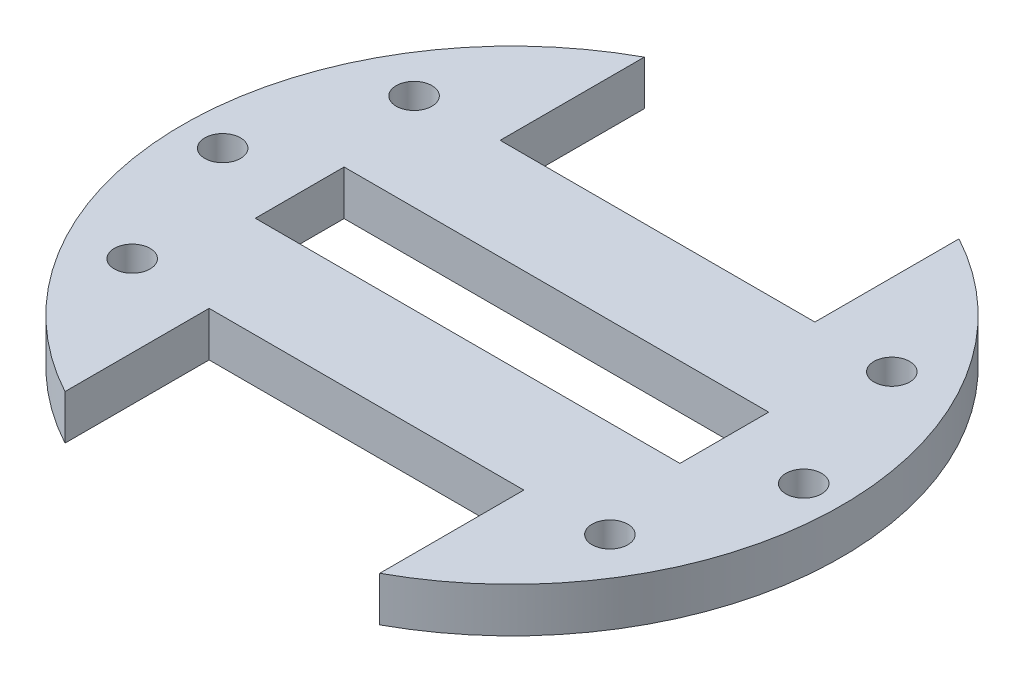
ISO-10303-21;
HEADER;
FILE_DESCRIPTION(('STEP AP214'),'2;1');
FILE_NAME('part.step','',(''),(''),'','','');
FILE_SCHEMA(('AUTOMOTIVE_DESIGN { 1 0 10303 214 1 1 1 1 }'));
ENDSEC;
DATA;
#1=APPLICATION_CONTEXT('core data for automotive mechanical design processes');
#2=APPLICATION_PROTOCOL_DEFINITION('international standard','automotive_design',2000,#1);
#3=PRODUCT_CONTEXT('',#1,'mechanical');
#4=PRODUCT('Part','Part','',(#3));
#5=PRODUCT_RELATED_PRODUCT_CATEGORY('part','',(#4));
#6=PRODUCT_DEFINITION_FORMATION('','',#4);
#7=PRODUCT_DEFINITION_CONTEXT('part definition',#1,'design');
#8=PRODUCT_DEFINITION('design','',#6,#7);
#9=PRODUCT_DEFINITION_SHAPE('','',#8);
#10=(LENGTH_UNIT() NAMED_UNIT(*) SI_UNIT(.MILLI.,.METRE.));
#11=(NAMED_UNIT(*) PLANE_ANGLE_UNIT() SI_UNIT($,.RADIAN.));
#12=(NAMED_UNIT(*) SI_UNIT($,.STERADIAN.) SOLID_ANGLE_UNIT());
#13=UNCERTAINTY_MEASURE_WITH_UNIT(LENGTH_MEASURE(1.E-05),#10,'distance_accuracy_value','');
#14=(GEOMETRIC_REPRESENTATION_CONTEXT(3) GLOBAL_UNCERTAINTY_ASSIGNED_CONTEXT((#13)) GLOBAL_UNIT_ASSIGNED_CONTEXT((#10,
#11,#12)) REPRESENTATION_CONTEXT('',''));
#15=CARTESIAN_POINT('',(0.,0.,0.));
#16=DIRECTION('',(0.,0.,1.));
#17=DIRECTION('',(1.,0.,0.));
#18=AXIS2_PLACEMENT_3D('',#15,#16,#17);
#19=CARTESIAN_POINT('',(0.,4.,0.));
#20=DIRECTION('',(0.,-1.,0.));
#21=DIRECTION('',(0.,0.,-1.));
#22=AXIS2_PLACEMENT_3D('',#19,#20,#21);
#23=CYLINDRICAL_SURFACE('',#22,29.5);
#24=CARTESIAN_POINT('',(0.,0.,0.));
#25=DIRECTION('',(0.,1.,0.));
#26=DIRECTION('',(0.,0.,1.));
#27=AXIS2_PLACEMENT_3D('',#24,#25,#26);
#28=CIRCLE('',#27,29.5);
#29=CARTESIAN_POINT('',(14.0831265655498,0.,25.9213338032345));
#30=VERTEX_POINT('',#29);
#31=CARTESIAN_POINT('',(14.0831265655494,0.,-25.9213338032347));
#32=VERTEX_POINT('',#31);
#33=EDGE_CURVE('E221',#30,#32,#28,.T.);
#34=ORIENTED_EDGE('',*,*,#33,.T.);
#35=DIRECTION('',(0.,-1.,0.));
#36=VECTOR('',#35,1.);
#37=CARTESIAN_POINT('',(14.0831265655494,4.,-25.9213338032347));
#38=LINE('',#37,#36);
#39=CARTESIAN_POINT('',(14.0831265655494,4.,-25.9213338032347));
#40=VERTEX_POINT('',#39);
#41=EDGE_CURVE('E213',#32,#40,#38,.F.);
#42=ORIENTED_EDGE('',*,*,#41,.T.);
#43=CARTESIAN_POINT('',(0.,4.,0.));
#44=DIRECTION('',(0.,1.,0.));
#45=DIRECTION('',(0.,0.,1.));
#46=AXIS2_PLACEMENT_3D('',#43,#44,#45);
#47=CIRCLE('',#46,29.5);
#48=CARTESIAN_POINT('',(14.0831265655498,4.,25.9213338032345));
#49=VERTEX_POINT('',#48);
#50=EDGE_CURVE('E217',#49,#40,#47,.T.);
#51=ORIENTED_EDGE('',*,*,#50,.F.);
#52=DIRECTION('',(0.,-1.,0.));
#53=VECTOR('',#52,1.);
#54=CARTESIAN_POINT('',(14.0831265655498,4.,25.9213338032345));
#55=LINE('',#54,#53);
#56=EDGE_CURVE('E186',#49,#30,#55,.T.);
#57=ORIENTED_EDGE('',*,*,#56,.T.);
#58=EDGE_LOOP('',(#34,#42,#51,#57));
#59=FACE_BOUND('',#58,.T.);
#60=ADVANCED_FACE('F39',(#59),#23,.T.);
#61=CARTESIAN_POINT('',(-14.0831265655494,4.,-25.9213338032347));
#62=VERTEX_POINT('',#61);
#63=CARTESIAN_POINT('',(-14.083126565549,4.,25.9213338032349));
#64=VERTEX_POINT('',#63);
#65=EDGE_CURVE('E220',#62,#64,#47,.T.);
#66=ORIENTED_EDGE('',*,*,#65,.F.);
#67=DIRECTION('',(0.,-1.,0.));
#68=VECTOR('',#67,1.);
#69=CARTESIAN_POINT('',(-14.0831265655494,4.,-25.9213338032347));
#70=LINE('',#69,#68);
#71=CARTESIAN_POINT('',(-14.0831265655494,0.,-25.9213338032347));
#72=VERTEX_POINT('',#71);
#73=EDGE_CURVE('E210',#62,#72,#70,.T.);
#74=ORIENTED_EDGE('',*,*,#73,.T.);
#75=CARTESIAN_POINT('',(-14.083126565549,0.,25.9213338032349));
#76=VERTEX_POINT('',#75);
#77=EDGE_CURVE('E216',#72,#76,#28,.T.);
#78=ORIENTED_EDGE('',*,*,#77,.T.);
#79=DIRECTION('',(0.,-1.,0.));
#80=VECTOR('',#79,1.);
#81=CARTESIAN_POINT('',(-14.083126565549,4.,25.9213338032349));
#82=LINE('',#81,#80);
#83=EDGE_CURVE('E207',#76,#64,#82,.F.);
#84=ORIENTED_EDGE('',*,*,#83,.T.);
#85=EDGE_LOOP('',(#66,#74,#78,#84));
#86=FACE_BOUND('',#85,.T.);
#87=ADVANCED_FACE('F41',(#86),#23,.T.);
#88=CARTESIAN_POINT('',(0.,4.,0.));
#89=DIRECTION('',(0.,1.,0.));
#90=DIRECTION('',(0.,0.,1.));
#91=AXIS2_PLACEMENT_3D('',#88,#89,#90);
#92=PLANE('',#91);
#93=CARTESIAN_POINT('',(-25.8935830159541,4.,0.));
#94=DIRECTION('',(0.,1.,0.));
#95=DIRECTION('',(0.,0.,1.));
#96=AXIS2_PLACEMENT_3D('',#93,#94,#95);
#97=CIRCLE('',#96,1.6);
#98=CARTESIAN_POINT('',(-25.8935830159541,4.,1.6));
#99=VERTEX_POINT('',#98);
#100=EDGE_CURVE('E413',#99,#99,#97,.T.);
#101=ORIENTED_EDGE('',*,*,#100,.F.);
#102=EDGE_LOOP('',(#101));
#103=FACE_BOUND('',#102,.T.);
#104=CARTESIAN_POINT('',(21.376,4.,12.613));
#105=DIRECTION('',(0.,1.,0.));
#106=DIRECTION('',(0.,0.,1.));
#107=AXIS2_PLACEMENT_3D('',#104,#105,#106);
#108=CIRCLE('',#107,1.6);
#109=CARTESIAN_POINT('',(21.376,4.,14.213));
#110=VERTEX_POINT('',#109);
#111=EDGE_CURVE('E421',#110,#110,#108,.T.);
#112=ORIENTED_EDGE('',*,*,#111,.F.);
#113=EDGE_LOOP('',(#112));
#114=FACE_BOUND('',#113,.T.);
#115=CARTESIAN_POINT('',(26.1064169840459,4.,0.));
#116=DIRECTION('',(0.,1.,0.));
#117=DIRECTION('',(0.,0.,1.));
#118=AXIS2_PLACEMENT_3D('',#115,#116,#117);
#119=CIRCLE('',#118,1.6);
#120=CARTESIAN_POINT('',(26.1064169840459,4.,1.6));
#121=VERTEX_POINT('',#120);
#122=EDGE_CURVE('E414',#121,#121,#119,.T.);
#123=ORIENTED_EDGE('',*,*,#122,.F.);
#124=EDGE_LOOP('',(#123));
#125=FACE_BOUND('',#124,.T.);
#126=CARTESIAN_POINT('',(-21.376,4.,-12.613));
#127=DIRECTION('',(0.,1.,0.));
#128=DIRECTION('',(0.,0.,1.));
#129=AXIS2_PLACEMENT_3D('',#126,#127,#128);
#130=CIRCLE('',#129,1.6);
#131=CARTESIAN_POINT('',(-21.376,4.,-11.013));
#132=VERTEX_POINT('',#131);
#133=EDGE_CURVE('E440',#132,#132,#130,.T.);
#134=ORIENTED_EDGE('',*,*,#133,.F.);
#135=EDGE_LOOP('',(#134));
#136=FACE_BOUND('',#135,.T.);
#137=CARTESIAN_POINT('',(21.376,4.,-12.613));
#138=DIRECTION('',(0.,1.,0.));
#139=DIRECTION('',(0.,0.,1.));
#140=AXIS2_PLACEMENT_3D('',#137,#138,#139);
#141=CIRCLE('',#140,1.6);
#142=CARTESIAN_POINT('',(21.376,4.,-11.013));
#143=VERTEX_POINT('',#142);
#144=EDGE_CURVE('E428',#143,#143,#141,.T.);
#145=ORIENTED_EDGE('',*,*,#144,.F.);
#146=EDGE_LOOP('',(#145));
#147=FACE_BOUND('',#146,.T.);
#148=CARTESIAN_POINT('',(-21.376,4.,12.613));
#149=DIRECTION('',(0.,1.,0.));
#150=DIRECTION('',(0.,0.,1.));
#151=AXIS2_PLACEMENT_3D('',#148,#149,#150);
#152=CIRCLE('',#151,1.6);
#153=CARTESIAN_POINT('',(-21.376,4.,14.213));
#154=VERTEX_POINT('',#153);
#155=EDGE_CURVE('E434',#154,#154,#152,.T.);
#156=ORIENTED_EDGE('',*,*,#155,.F.);
#157=EDGE_LOOP('',(#156));
#158=FACE_BOUND('',#157,.T.);
#159=DIRECTION('',(0.,0.,-1.));
#160=VECTOR('',#159,1.);
#161=CARTESIAN_POINT('',(19.,4.,3.97319970352666));
#162=LINE('',#161,#160);
#163=CARTESIAN_POINT('',(19.,4.,3.97319970352666));
#164=VERTEX_POINT('',#163);
#165=CARTESIAN_POINT('',(19.,4.,-3.97319970352666));
#166=VERTEX_POINT('',#165);
#167=EDGE_CURVE('E54',#164,#166,#162,.T.);
#168=ORIENTED_EDGE('',*,*,#167,.F.);
#169=DIRECTION('',(1.,0.,0.));
#170=VECTOR('',#169,1.);
#171=CARTESIAN_POINT('',(-19.,4.,3.97319970352666));
#172=LINE('',#171,#170);
#173=CARTESIAN_POINT('',(-19.,4.,3.97319970352666));
#174=VERTEX_POINT('',#173);
#175=EDGE_CURVE('E146',#174,#164,#172,.T.);
#176=ORIENTED_EDGE('',*,*,#175,.F.);
#177=DIRECTION('',(0.,0.,1.));
#178=VECTOR('',#177,1.);
#179=CARTESIAN_POINT('',(-19.,4.,3.97319970352666));
#180=LINE('',#179,#178);
#181=CARTESIAN_POINT('',(-19.,4.,-3.97319970352665));
#182=VERTEX_POINT('',#181);
#183=EDGE_CURVE('E149',#182,#174,#180,.T.);
#184=ORIENTED_EDGE('',*,*,#183,.F.);
#185=DIRECTION('',(-1.,0.,0.));
#186=VECTOR('',#185,1.);
#187=CARTESIAN_POINT('',(-19.,4.,-3.97319970352665));
#188=LINE('',#187,#186);
#189=EDGE_CURVE('E158',#166,#182,#188,.T.);
#190=ORIENTED_EDGE('',*,*,#189,.F.);
#191=EDGE_LOOP('',(#168,#176,#184,#190));
#192=FACE_BOUND('',#191,.T.);
#193=DIRECTION('',(0.,0.,-1.));
#194=VECTOR('',#193,1.);
#195=CARTESIAN_POINT('',(14.0831265655494,4.,-13.0230256450114));
#196=LINE('',#195,#194);
#197=CARTESIAN_POINT('',(14.0831265655494,4.,-13.0230256450114));
#198=VERTEX_POINT('',#197);
#199=EDGE_CURVE('E177',#198,#40,#196,.T.);
#200=ORIENTED_EDGE('',*,*,#199,.F.);
#201=DIRECTION('',(1.,0.,0.));
#202=VECTOR('',#201,1.);
#203=CARTESIAN_POINT('',(-14.0831265655494,4.,-13.0230256450114));
#204=LINE('',#203,#202);
#205=CARTESIAN_POINT('',(-14.0831265655494,4.,-13.0230256450114));
#206=VERTEX_POINT('',#205);
#207=EDGE_CURVE('E173',#206,#198,#204,.T.);
#208=ORIENTED_EDGE('',*,*,#207,.F.);
#209=DIRECTION('',(0.,0.,1.));
#210=VECTOR('',#209,1.);
#211=CARTESIAN_POINT('',(-14.0831265655494,4.,-13.0230256450114));
#212=LINE('',#211,#210);
#213=EDGE_CURVE('E179',#62,#206,#212,.T.);
#214=ORIENTED_EDGE('',*,*,#213,.F.);
#215=ORIENTED_EDGE('',*,*,#65,.T.);
#216=DIRECTION('',(0.,0.,1.));
#217=VECTOR('',#216,1.);
#218=CARTESIAN_POINT('',(-14.0831265655486,4.,13.0230256450114));
#219=LINE('',#218,#217);
#220=CARTESIAN_POINT('',(-14.0831265655486,4.,13.0230256450114));
#221=VERTEX_POINT('',#220);
#222=EDGE_CURVE('E194',#221,#64,#219,.T.);
#223=ORIENTED_EDGE('',*,*,#222,.F.);
#224=DIRECTION('',(-1.,0.,0.));
#225=VECTOR('',#224,1.);
#226=CARTESIAN_POINT('',(14.0831265655501,4.,13.0230256450114));
#227=LINE('',#226,#225);
#228=CARTESIAN_POINT('',(14.0831265655501,4.,13.0230256450114));
#229=VERTEX_POINT('',#228);
#230=EDGE_CURVE('E196',#229,#221,#227,.T.);
#231=ORIENTED_EDGE('',*,*,#230,.F.);
#232=DIRECTION('',(0.,0.,-1.));
#233=VECTOR('',#232,1.);
#234=CARTESIAN_POINT('',(14.0831265655501,4.,13.0230256450114));
#235=LINE('',#234,#233);
#236=EDGE_CURVE('E180',#49,#229,#235,.T.);
#237=ORIENTED_EDGE('',*,*,#236,.F.);
#238=ORIENTED_EDGE('',*,*,#50,.T.);
#239=EDGE_LOOP('',(#200,#208,#214,#215,#223,#231,#237,#238));
#240=FACE_BOUND('',#239,.T.);
#241=ADVANCED_FACE('F233',(#103,#114,#125,#136,#147,#158,#192,#240),#92,.T.);
#242=CARTESIAN_POINT('',(0.,0.,0.));
#243=DIRECTION('',(0.,1.,0.));
#244=DIRECTION('',(0.,0.,1.));
#245=AXIS2_PLACEMENT_3D('',#242,#243,#244);
#246=PLANE('',#245);
#247=CARTESIAN_POINT('',(-25.8935830159541,0.,0.));
#248=DIRECTION('',(0.,1.,0.));
#249=DIRECTION('',(0.,0.,1.));
#250=AXIS2_PLACEMENT_3D('',#247,#248,#249);
#251=CIRCLE('',#250,1.6);
#252=CARTESIAN_POINT('',(-25.8935830159541,0.,1.6));
#253=VERTEX_POINT('',#252);
#254=EDGE_CURVE('E159',#253,#253,#251,.T.);
#255=ORIENTED_EDGE('',*,*,#254,.T.);
#256=EDGE_LOOP('',(#255));
#257=FACE_BOUND('',#256,.T.);
#258=CARTESIAN_POINT('',(21.376,0.,12.613));
#259=DIRECTION('',(0.,1.,0.));
#260=DIRECTION('',(0.,0.,1.));
#261=AXIS2_PLACEMENT_3D('',#258,#259,#260);
#262=CIRCLE('',#261,1.6);
#263=CARTESIAN_POINT('',(21.376,0.,14.213));
#264=VERTEX_POINT('',#263);
#265=EDGE_CURVE('E425',#264,#264,#262,.T.);
#266=ORIENTED_EDGE('',*,*,#265,.T.);
#267=EDGE_LOOP('',(#266));
#268=FACE_BOUND('',#267,.T.);
#269=CARTESIAN_POINT('',(26.1064169840459,0.,0.));
#270=DIRECTION('',(0.,1.,0.));
#271=DIRECTION('',(0.,0.,1.));
#272=AXIS2_PLACEMENT_3D('',#269,#270,#271);
#273=CIRCLE('',#272,1.6);
#274=CARTESIAN_POINT('',(26.1064169840459,0.,1.6));
#275=VERTEX_POINT('',#274);
#276=EDGE_CURVE('E418',#275,#275,#273,.T.);
#277=ORIENTED_EDGE('',*,*,#276,.T.);
#278=EDGE_LOOP('',(#277));
#279=FACE_BOUND('',#278,.T.);
#280=CARTESIAN_POINT('',(-21.376,0.,-12.613));
#281=DIRECTION('',(0.,1.,0.));
#282=DIRECTION('',(0.,0.,1.));
#283=AXIS2_PLACEMENT_3D('',#280,#281,#282);
#284=CIRCLE('',#283,1.6);
#285=CARTESIAN_POINT('',(-21.376,0.,-11.013));
#286=VERTEX_POINT('',#285);
#287=EDGE_CURVE('E152',#286,#286,#284,.T.);
#288=ORIENTED_EDGE('',*,*,#287,.T.);
#289=EDGE_LOOP('',(#288));
#290=FACE_BOUND('',#289,.T.);
#291=CARTESIAN_POINT('',(21.376,0.,-12.613));
#292=DIRECTION('',(0.,1.,0.));
#293=DIRECTION('',(0.,0.,1.));
#294=AXIS2_PLACEMENT_3D('',#291,#292,#293);
#295=CIRCLE('',#294,1.6);
#296=CARTESIAN_POINT('',(21.376,0.,-11.013));
#297=VERTEX_POINT('',#296);
#298=EDGE_CURVE('E431',#297,#297,#295,.T.);
#299=ORIENTED_EDGE('',*,*,#298,.T.);
#300=EDGE_LOOP('',(#299));
#301=FACE_BOUND('',#300,.T.);
#302=CARTESIAN_POINT('',(-21.376,0.,12.613));
#303=DIRECTION('',(0.,1.,0.));
#304=DIRECTION('',(0.,0.,1.));
#305=AXIS2_PLACEMENT_3D('',#302,#303,#304);
#306=CIRCLE('',#305,1.6);
#307=CARTESIAN_POINT('',(-21.376,0.,14.213));
#308=VERTEX_POINT('',#307);
#309=EDGE_CURVE('E424',#308,#308,#306,.T.);
#310=ORIENTED_EDGE('',*,*,#309,.T.);
#311=EDGE_LOOP('',(#310));
#312=FACE_BOUND('',#311,.T.);
#313=DIRECTION('',(1.,0.,0.));
#314=VECTOR('',#313,1.);
#315=CARTESIAN_POINT('',(-19.,0.,3.97319970352666));
#316=LINE('',#315,#314);
#317=CARTESIAN_POINT('',(-19.,0.,3.97319970352666));
#318=VERTEX_POINT('',#317);
#319=CARTESIAN_POINT('',(19.,0.,3.97319970352666));
#320=VERTEX_POINT('',#319);
#321=EDGE_CURVE('E136',#318,#320,#316,.T.);
#322=ORIENTED_EDGE('',*,*,#321,.T.);
#323=DIRECTION('',(0.,0.,-1.));
#324=VECTOR('',#323,1.);
#325=CARTESIAN_POINT('',(19.,0.,3.97319970352666));
#326=LINE('',#325,#324);
#327=CARTESIAN_POINT('',(19.,0.,-3.97319970352666));
#328=VERTEX_POINT('',#327);
#329=EDGE_CURVE('E130',#320,#328,#326,.T.);
#330=ORIENTED_EDGE('',*,*,#329,.T.);
#331=DIRECTION('',(-1.,0.,0.));
#332=VECTOR('',#331,1.);
#333=CARTESIAN_POINT('',(-19.,0.,-3.97319970352665));
#334=LINE('',#333,#332);
#335=CARTESIAN_POINT('',(-19.,0.,-3.97319970352665));
#336=VERTEX_POINT('',#335);
#337=EDGE_CURVE('E139',#328,#336,#334,.T.);
#338=ORIENTED_EDGE('',*,*,#337,.T.);
#339=DIRECTION('',(0.,0.,1.));
#340=VECTOR('',#339,1.);
#341=CARTESIAN_POINT('',(-19.,0.,3.97319970352666));
#342=LINE('',#341,#340);
#343=EDGE_CURVE('E62',#336,#318,#342,.T.);
#344=ORIENTED_EDGE('',*,*,#343,.T.);
#345=EDGE_LOOP('',(#322,#330,#338,#344));
#346=FACE_BOUND('',#345,.T.);
#347=DIRECTION('',(1.,0.,0.));
#348=VECTOR('',#347,1.);
#349=CARTESIAN_POINT('',(-14.0831265655494,0.,-13.0230256450114));
#350=LINE('',#349,#348);
#351=CARTESIAN_POINT('',(-14.0831265655494,0.,-13.0230256450114));
#352=VERTEX_POINT('',#351);
#353=CARTESIAN_POINT('',(14.0831265655494,0.,-13.0230256450114));
#354=VERTEX_POINT('',#353);
#355=EDGE_CURVE('E172',#352,#354,#350,.T.);
#356=ORIENTED_EDGE('',*,*,#355,.T.);
#357=DIRECTION('',(0.,0.,-1.));
#358=VECTOR('',#357,1.);
#359=CARTESIAN_POINT('',(14.0831265655494,0.,-13.0230256450114));
#360=LINE('',#359,#358);
#361=EDGE_CURVE('E169',#354,#32,#360,.T.);
#362=ORIENTED_EDGE('',*,*,#361,.T.);
#363=ORIENTED_EDGE('',*,*,#33,.F.);
#364=DIRECTION('',(0.,0.,-1.));
#365=VECTOR('',#364,1.);
#366=CARTESIAN_POINT('',(14.0831265655505,0.,3.81052658316552E-13));
#367=LINE('',#366,#365);
#368=CARTESIAN_POINT('',(14.0831265655501,0.,13.0230256450114));
#369=VERTEX_POINT('',#368);
#370=EDGE_CURVE('E47',#30,#369,#367,.T.);
#371=ORIENTED_EDGE('',*,*,#370,.T.);
#372=DIRECTION('',(-1.,0.,0.));
#373=VECTOR('',#372,1.);
#374=CARTESIAN_POINT('',(14.0831265655501,0.,13.0230256450114));
#375=LINE('',#374,#373);
#376=CARTESIAN_POINT('',(-14.0831265655486,0.,13.0230256450114));
#377=VERTEX_POINT('',#376);
#378=EDGE_CURVE('E197',#369,#377,#375,.T.);
#379=ORIENTED_EDGE('',*,*,#378,.T.);
#380=DIRECTION('',(0.,0.,1.));
#381=VECTOR('',#380,1.);
#382=CARTESIAN_POINT('',(-14.0831265655486,0.,13.0230256450114));
#383=LINE('',#382,#381);
#384=EDGE_CURVE('E192',#377,#76,#383,.T.);
#385=ORIENTED_EDGE('',*,*,#384,.T.);
#386=ORIENTED_EDGE('',*,*,#77,.F.);
#387=DIRECTION('',(0.,0.,1.));
#388=VECTOR('',#387,1.);
#389=CARTESIAN_POINT('',(-14.0831265655494,0.,0.));
#390=LINE('',#389,#388);
#391=EDGE_CURVE('E11',#72,#352,#390,.T.);
#392=ORIENTED_EDGE('',*,*,#391,.T.);
#393=EDGE_LOOP('',(#356,#362,#363,#371,#379,#385,#386,#392));
#394=FACE_BOUND('',#393,.T.);
#395=ADVANCED_FACE('F143',(#257,#268,#279,#290,#301,#312,#346,#394),#246,.F.);
#396=CARTESIAN_POINT('',(-14.0831265655486,0.,13.0230256450114));
#397=DIRECTION('',(-1.,0.,0.));
#398=DIRECTION('',(0.,0.,1.));
#399=AXIS2_PLACEMENT_3D('',#396,#397,#398);
#400=PLANE('',#399);
#401=ORIENTED_EDGE('',*,*,#384,.F.);
#402=DIRECTION('',(0.,1.,0.));
#403=VECTOR('',#402,1.);
#404=CARTESIAN_POINT('',(-14.0831265655486,0.,13.0230256450114));
#405=LINE('',#404,#403);
#406=EDGE_CURVE('E165',#377,#221,#405,.T.);
#407=ORIENTED_EDGE('',*,*,#406,.T.);
#408=ORIENTED_EDGE('',*,*,#222,.T.);
#409=ORIENTED_EDGE('',*,*,#83,.F.);
#410=EDGE_LOOP('',(#401,#407,#408,#409));
#411=FACE_BOUND('',#410,.T.);
#412=ADVANCED_FACE('F241',(#411),#400,.F.);
#413=CARTESIAN_POINT('',(14.0831265655501,0.,13.0230256450114));
#414=DIRECTION('',(1.,0.,0.));
#415=DIRECTION('',(0.,0.,-1.));
#416=AXIS2_PLACEMENT_3D('',#413,#414,#415);
#417=PLANE('',#416);
#418=ORIENTED_EDGE('',*,*,#236,.T.);
#419=DIRECTION('',(0.,1.,0.));
#420=VECTOR('',#419,1.);
#421=CARTESIAN_POINT('',(14.0831265655501,0.,13.0230256450114));
#422=LINE('',#421,#420);
#423=EDGE_CURVE('E189',#369,#229,#422,.T.);
#424=ORIENTED_EDGE('',*,*,#423,.F.);
#425=ORIENTED_EDGE('',*,*,#370,.F.);
#426=ORIENTED_EDGE('',*,*,#56,.F.);
#427=EDGE_LOOP('',(#418,#424,#425,#426));
#428=FACE_BOUND('',#427,.T.);
#429=ADVANCED_FACE('F227',(#428),#417,.F.);
#430=CARTESIAN_POINT('',(14.0831265655501,0.,13.0230256450114));
#431=DIRECTION('',(0.,0.,-1.));
#432=DIRECTION('',(-1.,0.,0.));
#433=AXIS2_PLACEMENT_3D('',#430,#431,#432);
#434=PLANE('',#433);
#435=ORIENTED_EDGE('',*,*,#230,.T.);
#436=ORIENTED_EDGE('',*,*,#406,.F.);
#437=ORIENTED_EDGE('',*,*,#378,.F.);
#438=ORIENTED_EDGE('',*,*,#423,.T.);
#439=EDGE_LOOP('',(#435,#436,#437,#438));
#440=FACE_BOUND('',#439,.T.);
#441=ADVANCED_FACE('F238',(#440),#434,.F.);
#442=CARTESIAN_POINT('',(14.0831265655494,0.,-13.0230256450114));
#443=DIRECTION('',(1.,0.,0.));
#444=DIRECTION('',(0.,0.,-1.));
#445=AXIS2_PLACEMENT_3D('',#442,#443,#444);
#446=PLANE('',#445);
#447=ORIENTED_EDGE('',*,*,#361,.F.);
#448=DIRECTION('',(0.,1.,0.));
#449=VECTOR('',#448,1.);
#450=CARTESIAN_POINT('',(14.0831265655494,0.,-13.0230256450114));
#451=LINE('',#450,#449);
#452=EDGE_CURVE('E184',#354,#198,#451,.T.);
#453=ORIENTED_EDGE('',*,*,#452,.T.);
#454=ORIENTED_EDGE('',*,*,#199,.T.);
#455=ORIENTED_EDGE('',*,*,#41,.F.);
#456=EDGE_LOOP('',(#447,#453,#454,#455));
#457=FACE_BOUND('',#456,.T.);
#458=ADVANCED_FACE('F255',(#457),#446,.F.);
#459=CARTESIAN_POINT('',(-14.0831265655494,0.,-13.0230256450114));
#460=DIRECTION('',(-1.,0.,0.));
#461=DIRECTION('',(0.,0.,1.));
#462=AXIS2_PLACEMENT_3D('',#459,#460,#461);
#463=PLANE('',#462);
#464=ORIENTED_EDGE('',*,*,#213,.T.);
#465=DIRECTION('',(0.,1.,0.));
#466=VECTOR('',#465,1.);
#467=CARTESIAN_POINT('',(-14.0831265655494,0.,-13.0230256450114));
#468=LINE('',#467,#466);
#469=EDGE_CURVE('E176',#352,#206,#468,.T.);
#470=ORIENTED_EDGE('',*,*,#469,.F.);
#471=ORIENTED_EDGE('',*,*,#391,.F.);
#472=ORIENTED_EDGE('',*,*,#73,.F.);
#473=EDGE_LOOP('',(#464,#470,#471,#472));
#474=FACE_BOUND('',#473,.T.);
#475=ADVANCED_FACE('F249',(#474),#463,.F.);
#476=CARTESIAN_POINT('',(-14.0831265655494,0.,-13.0230256450114));
#477=DIRECTION('',(0.,0.,1.));
#478=DIRECTION('',(1.,0.,0.));
#479=AXIS2_PLACEMENT_3D('',#476,#477,#478);
#480=PLANE('',#479);
#481=ORIENTED_EDGE('',*,*,#207,.T.);
#482=ORIENTED_EDGE('',*,*,#452,.F.);
#483=ORIENTED_EDGE('',*,*,#355,.F.);
#484=ORIENTED_EDGE('',*,*,#469,.T.);
#485=EDGE_LOOP('',(#481,#482,#483,#484));
#486=FACE_BOUND('',#485,.T.);
#487=ADVANCED_FACE('F252',(#486),#480,.F.);
#488=CARTESIAN_POINT('',(19.,0.,3.97319970352666));
#489=DIRECTION('',(1.,0.,0.));
#490=DIRECTION('',(0.,0.,-1.));
#491=AXIS2_PLACEMENT_3D('',#488,#489,#490);
#492=PLANE('',#491);
#493=ORIENTED_EDGE('',*,*,#167,.T.);
#494=DIRECTION('',(0.,1.,0.));
#495=VECTOR('',#494,1.);
#496=CARTESIAN_POINT('',(19.,0.,-3.97319970352666));
#497=LINE('',#496,#495);
#498=EDGE_CURVE('E126',#328,#166,#497,.T.);
#499=ORIENTED_EDGE('',*,*,#498,.F.);
#500=ORIENTED_EDGE('',*,*,#329,.F.);
#501=DIRECTION('',(0.,1.,0.));
#502=VECTOR('',#501,1.);
#503=CARTESIAN_POINT('',(19.,0.,3.97319970352666));
#504=LINE('',#503,#502);
#505=EDGE_CURVE('E163',#320,#164,#504,.T.);
#506=ORIENTED_EDGE('',*,*,#505,.T.);
#507=EDGE_LOOP('',(#493,#499,#500,#506));
#508=FACE_BOUND('',#507,.T.);
#509=ADVANCED_FACE('F128',(#508),#492,.F.);
#510=CARTESIAN_POINT('',(-19.,0.,3.97319970352666));
#511=DIRECTION('',(0.,0.,1.));
#512=DIRECTION('',(1.,0.,0.));
#513=AXIS2_PLACEMENT_3D('',#510,#511,#512);
#514=PLANE('',#513);
#515=ORIENTED_EDGE('',*,*,#175,.T.);
#516=ORIENTED_EDGE('',*,*,#505,.F.);
#517=ORIENTED_EDGE('',*,*,#321,.F.);
#518=DIRECTION('',(0.,1.,0.));
#519=VECTOR('',#518,1.);
#520=CARTESIAN_POINT('',(-19.,0.,3.97319970352666));
#521=LINE('',#520,#519);
#522=EDGE_CURVE('E166',#318,#174,#521,.T.);
#523=ORIENTED_EDGE('',*,*,#522,.T.);
#524=EDGE_LOOP('',(#515,#516,#517,#523));
#525=FACE_BOUND('',#524,.T.);
#526=ADVANCED_FACE('F321',(#525),#514,.F.);
#527=CARTESIAN_POINT('',(-19.,0.,3.97319970352666));
#528=DIRECTION('',(-1.,0.,0.));
#529=DIRECTION('',(0.,0.,1.));
#530=AXIS2_PLACEMENT_3D('',#527,#528,#529);
#531=PLANE('',#530);
#532=ORIENTED_EDGE('',*,*,#183,.T.);
#533=ORIENTED_EDGE('',*,*,#522,.F.);
#534=ORIENTED_EDGE('',*,*,#343,.F.);
#535=DIRECTION('',(0.,1.,0.));
#536=VECTOR('',#535,1.);
#537=CARTESIAN_POINT('',(-19.,0.,-3.97319970352665));
#538=LINE('',#537,#536);
#539=EDGE_CURVE('E135',#336,#182,#538,.T.);
#540=ORIENTED_EDGE('',*,*,#539,.T.);
#541=EDGE_LOOP('',(#532,#533,#534,#540));
#542=FACE_BOUND('',#541,.T.);
#543=ADVANCED_FACE('F330',(#542),#531,.F.);
#544=CARTESIAN_POINT('',(-19.,0.,-3.97319970352665));
#545=DIRECTION('',(0.,0.,-1.));
#546=DIRECTION('',(-1.,0.,0.));
#547=AXIS2_PLACEMENT_3D('',#544,#545,#546);
#548=PLANE('',#547);
#549=ORIENTED_EDGE('',*,*,#189,.T.);
#550=ORIENTED_EDGE('',*,*,#539,.F.);
#551=ORIENTED_EDGE('',*,*,#337,.F.);
#552=ORIENTED_EDGE('',*,*,#498,.T.);
#553=EDGE_LOOP('',(#549,#550,#551,#552));
#554=FACE_BOUND('',#553,.T.);
#555=ADVANCED_FACE('F140',(#554),#548,.F.);
#556=CARTESIAN_POINT('',(-21.376,0.,12.613));
#557=DIRECTION('',(0.,1.,0.));
#558=DIRECTION('',(0.,0.,1.));
#559=AXIS2_PLACEMENT_3D('',#556,#557,#558);
#560=CYLINDRICAL_SURFACE('',#559,1.6);
#561=ORIENTED_EDGE('',*,*,#309,.F.);
#562=EDGE_LOOP('',(#561));
#563=FACE_BOUND('',#562,.T.);
#564=ORIENTED_EDGE('',*,*,#155,.T.);
#565=EDGE_LOOP('',(#564));
#566=FACE_BOUND('',#565,.T.);
#567=ADVANCED_FACE('F347',(#563,#566),#560,.F.);
#568=CARTESIAN_POINT('',(21.376,0.,-12.613));
#569=DIRECTION('',(0.,1.,0.));
#570=DIRECTION('',(0.,0.,1.));
#571=AXIS2_PLACEMENT_3D('',#568,#569,#570);
#572=CYLINDRICAL_SURFACE('',#571,1.6);
#573=ORIENTED_EDGE('',*,*,#298,.F.);
#574=EDGE_LOOP('',(#573));
#575=FACE_BOUND('',#574,.T.);
#576=ORIENTED_EDGE('',*,*,#144,.T.);
#577=EDGE_LOOP('',(#576));
#578=FACE_BOUND('',#577,.T.);
#579=ADVANCED_FACE('F356',(#575,#578),#572,.F.);
#580=CARTESIAN_POINT('',(-21.376,0.,-12.613));
#581=DIRECTION('',(0.,1.,0.));
#582=DIRECTION('',(0.,0.,1.));
#583=AXIS2_PLACEMENT_3D('',#580,#581,#582);
#584=CYLINDRICAL_SURFACE('',#583,1.6);
#585=ORIENTED_EDGE('',*,*,#287,.F.);
#586=EDGE_LOOP('',(#585));
#587=FACE_BOUND('',#586,.T.);
#588=ORIENTED_EDGE('',*,*,#133,.T.);
#589=EDGE_LOOP('',(#588));
#590=FACE_BOUND('',#589,.T.);
#591=ADVANCED_FACE('F366',(#587,#590),#584,.F.);
#592=CARTESIAN_POINT('',(26.1064169840459,0.,0.));
#593=DIRECTION('',(0.,1.,0.));
#594=DIRECTION('',(0.,0.,1.));
#595=AXIS2_PLACEMENT_3D('',#592,#593,#594);
#596=CYLINDRICAL_SURFACE('',#595,1.6);
#597=ORIENTED_EDGE('',*,*,#276,.F.);
#598=EDGE_LOOP('',(#597));
#599=FACE_BOUND('',#598,.T.);
#600=ORIENTED_EDGE('',*,*,#122,.T.);
#601=EDGE_LOOP('',(#600));
#602=FACE_BOUND('',#601,.T.);
#603=ADVANCED_FACE('F376',(#599,#602),#596,.F.);
#604=CARTESIAN_POINT('',(21.376,0.,12.613));
#605=DIRECTION('',(0.,1.,0.));
#606=DIRECTION('',(0.,0.,1.));
#607=AXIS2_PLACEMENT_3D('',#604,#605,#606);
#608=CYLINDRICAL_SURFACE('',#607,1.6);
#609=ORIENTED_EDGE('',*,*,#265,.F.);
#610=EDGE_LOOP('',(#609));
#611=FACE_BOUND('',#610,.T.);
#612=ORIENTED_EDGE('',*,*,#111,.T.);
#613=EDGE_LOOP('',(#612));
#614=FACE_BOUND('',#613,.T.);
#615=ADVANCED_FACE('F386',(#611,#614),#608,.F.);
#616=CARTESIAN_POINT('',(-25.8935830159541,0.,0.));
#617=DIRECTION('',(0.,1.,0.));
#618=DIRECTION('',(0.,0.,1.));
#619=AXIS2_PLACEMENT_3D('',#616,#617,#618);
#620=CYLINDRICAL_SURFACE('',#619,1.6);
#621=ORIENTED_EDGE('',*,*,#254,.F.);
#622=EDGE_LOOP('',(#621));
#623=FACE_BOUND('',#622,.T.);
#624=ORIENTED_EDGE('',*,*,#100,.T.);
#625=EDGE_LOOP('',(#624));
#626=FACE_BOUND('',#625,.T.);
#627=ADVANCED_FACE('F396',(#623,#626),#620,.F.);
#628=CLOSED_SHELL('',(#60,#87,#241,#395,#412,#429,#441,#458,#475,#487,#509,#526,#543,#555,#567,
#579,#591,#603,#615,#627));
#629=MANIFOLD_SOLID_BREP('B2',#628);
#630=ADVANCED_BREP_SHAPE_REPRESENTATION('',(#18,#629),#14);
#631=SHAPE_DEFINITION_REPRESENTATION(#9,#630);
ENDSEC;
END-ISO-10303-21;
